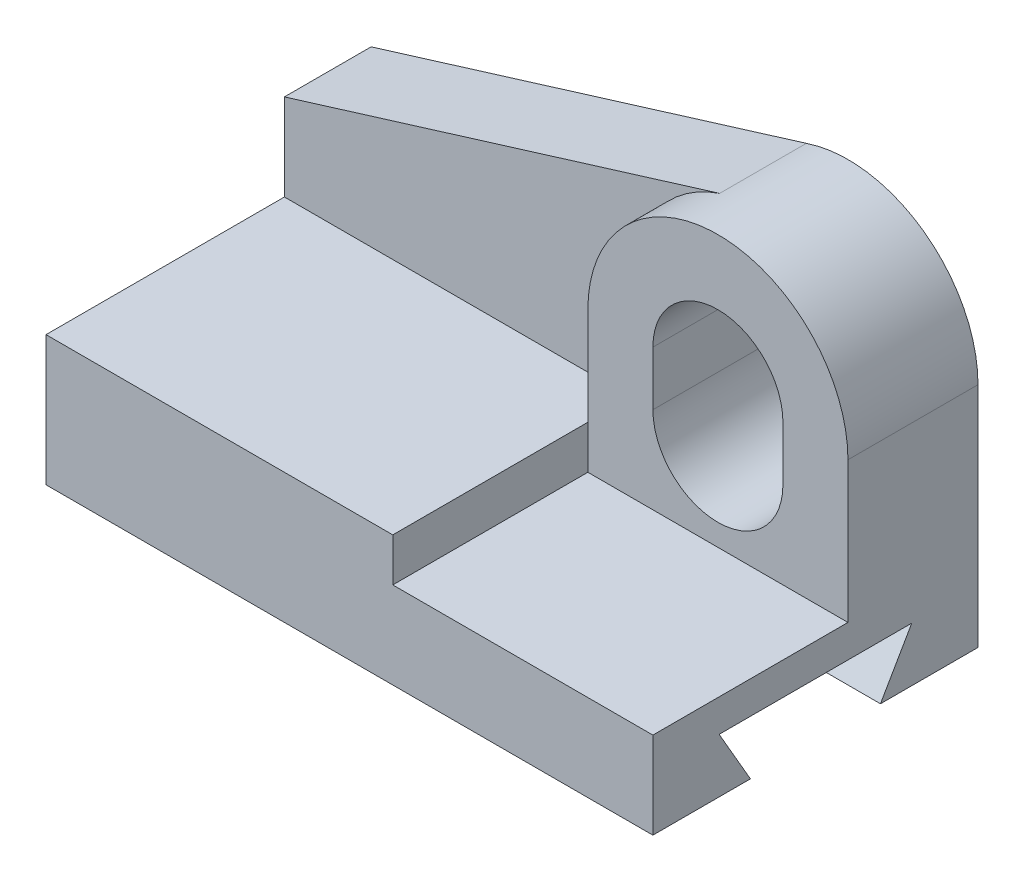
ISO-10303-21;
HEADER;
FILE_DESCRIPTION(('STEP AP214'),'2;1');
FILE_NAME('part.step','',(''),(''),'','','');
FILE_SCHEMA(('AUTOMOTIVE_DESIGN { 1 0 10303 214 1 1 1 1 }'));
ENDSEC;
DATA;
#1=APPLICATION_CONTEXT('core data for automotive mechanical design processes');
#2=APPLICATION_PROTOCOL_DEFINITION('international standard','automotive_design',2000,#1);
#3=PRODUCT_CONTEXT('',#1,'mechanical');
#4=PRODUCT('Part','Part','',(#3));
#5=PRODUCT_RELATED_PRODUCT_CATEGORY('part','',(#4));
#6=PRODUCT_DEFINITION_FORMATION('','',#4);
#7=PRODUCT_DEFINITION_CONTEXT('part definition',#1,'design');
#8=PRODUCT_DEFINITION('design','',#6,#7);
#9=PRODUCT_DEFINITION_SHAPE('','',#8);
#10=(LENGTH_UNIT() NAMED_UNIT(*) SI_UNIT(.MILLI.,.METRE.));
#11=(NAMED_UNIT(*) PLANE_ANGLE_UNIT() SI_UNIT($,.RADIAN.));
#12=(NAMED_UNIT(*) SI_UNIT($,.STERADIAN.) SOLID_ANGLE_UNIT());
#13=UNCERTAINTY_MEASURE_WITH_UNIT(LENGTH_MEASURE(1.E-05),#10,'distance_accuracy_value','');
#14=(GEOMETRIC_REPRESENTATION_CONTEXT(3) GLOBAL_UNCERTAINTY_ASSIGNED_CONTEXT((#13)) GLOBAL_UNIT_ASSIGNED_CONTEXT((#10,
#11,#12)) REPRESENTATION_CONTEXT('',''));
#15=CARTESIAN_POINT('',(0.,0.,0.));
#16=DIRECTION('',(0.,0.,1.));
#17=DIRECTION('',(1.,0.,0.));
#18=AXIS2_PLACEMENT_3D('',#15,#16,#17);
#19=CARTESIAN_POINT('',(0.,0.,30.));
#20=DIRECTION('',(0.,1.,0.));
#21=DIRECTION('',(0.,0.,1.));
#22=AXIS2_PLACEMENT_3D('',#19,#20,#21);
#23=PLANE('',#22);
#24=DIRECTION('',(0.,0.,-1.));
#25=VECTOR('',#24,1.);
#26=CARTESIAN_POINT('',(0.,0.,30.));
#27=LINE('',#26,#25);
#28=CARTESIAN_POINT('',(0.,0.,30.));
#29=VERTEX_POINT('',#28);
#30=CARTESIAN_POINT('',(0.,0.,21.));
#31=VERTEX_POINT('',#30);
#32=EDGE_CURVE('E11',#29,#31,#27,.T.);
#33=ORIENTED_EDGE('',*,*,#32,.T.);
#34=DIRECTION('',(-1.,0.,0.));
#35=VECTOR('',#34,1.);
#36=CARTESIAN_POINT('',(56.,0.,21.));
#37=LINE('',#36,#35);
#38=CARTESIAN_POINT('',(56.,0.,21.));
#39=VERTEX_POINT('',#38);
#40=EDGE_CURVE('E213',#39,#31,#37,.T.);
#41=ORIENTED_EDGE('',*,*,#40,.F.);
#42=DIRECTION('',(0.,0.,-1.));
#43=VECTOR('',#42,1.);
#44=CARTESIAN_POINT('',(56.,0.,30.));
#45=LINE('',#44,#43);
#46=CARTESIAN_POINT('',(56.,0.,30.));
#47=VERTEX_POINT('',#46);
#48=EDGE_CURVE('E199',#47,#39,#45,.T.);
#49=ORIENTED_EDGE('',*,*,#48,.F.);
#50=DIRECTION('',(1.,0.,0.));
#51=VECTOR('',#50,1.);
#52=CARTESIAN_POINT('',(0.,0.,30.));
#53=LINE('',#52,#51);
#54=EDGE_CURVE('E327',#29,#47,#53,.T.);
#55=ORIENTED_EDGE('',*,*,#54,.F.);
#56=EDGE_LOOP('',(#33,#41,#49,#55));
#57=FACE_BOUND('',#56,.T.);
#58=ADVANCED_FACE('F45',(#57),#23,.F.);
#59=CARTESIAN_POINT('',(0.,12.,30.));
#60=DIRECTION('',(1.,0.,0.));
#61=DIRECTION('',(0.,0.,-1.));
#62=AXIS2_PLACEMENT_3D('',#59,#60,#61);
#63=PLANE('',#62);
#64=DIRECTION('',(0.,0.,-1.));
#65=VECTOR('',#64,1.);
#66=CARTESIAN_POINT('',(0.,5.,23.8867513459482));
#67=LINE('',#66,#65);
#68=CARTESIAN_POINT('',(0.,5.,23.8867513459482));
#69=VERTEX_POINT('',#68);
#70=CARTESIAN_POINT('',(0.,5.,6.11324865405184));
#71=VERTEX_POINT('',#70);
#72=EDGE_CURVE('E204',#69,#71,#67,.T.);
#73=ORIENTED_EDGE('',*,*,#72,.F.);
#74=DIRECTION('',(0.,0.866025403784436,0.500000000000004));
#75=VECTOR('',#74,1.);
#76=CARTESIAN_POINT('',(0.,0.,21.));
#77=LINE('',#76,#75);
#78=EDGE_CURVE('E182',#31,#69,#77,.T.);
#79=ORIENTED_EDGE('',*,*,#78,.F.);
#80=ORIENTED_EDGE('',*,*,#32,.F.);
#81=DIRECTION('',(0.,-1.,0.));
#82=VECTOR('',#81,1.);
#83=CARTESIAN_POINT('',(0.,12.,30.));
#84=LINE('',#83,#82);
#85=CARTESIAN_POINT('',(0.,12.,30.));
#86=VERTEX_POINT('',#85);
#87=EDGE_CURVE('E323',#86,#29,#84,.T.);
#88=ORIENTED_EDGE('',*,*,#87,.F.);
#89=DIRECTION('',(0.,0.,-1.));
#90=VECTOR('',#89,1.);
#91=CARTESIAN_POINT('',(0.,12.,30.));
#92=LINE('',#91,#90);
#93=CARTESIAN_POINT('',(0.,12.,8.));
#94=VERTEX_POINT('',#93);
#95=EDGE_CURVE('E343',#86,#94,#92,.T.);
#96=ORIENTED_EDGE('',*,*,#95,.T.);
#97=DIRECTION('',(0.,1.,0.));
#98=VECTOR('',#97,1.);
#99=CARTESIAN_POINT('',(0.,0.,8.));
#100=LINE('',#99,#98);
#101=CARTESIAN_POINT('',(0.,20.,8.));
#102=VERTEX_POINT('',#101);
#103=EDGE_CURVE('E230',#94,#102,#100,.T.);
#104=ORIENTED_EDGE('',*,*,#103,.T.);
#105=DIRECTION('',(0.,0.,-1.));
#106=VECTOR('',#105,1.);
#107=CARTESIAN_POINT('',(0.,20.,8.));
#108=LINE('',#107,#106);
#109=CARTESIAN_POINT('',(0.,20.,0.));
#110=VERTEX_POINT('',#109);
#111=EDGE_CURVE('E239',#102,#110,#108,.T.);
#112=ORIENTED_EDGE('',*,*,#111,.T.);
#113=DIRECTION('',(0.,-1.,0.));
#114=VECTOR('',#113,1.);
#115=CARTESIAN_POINT('',(0.,12.,0.));
#116=LINE('',#115,#114);
#117=CARTESIAN_POINT('',(0.,0.,0.));
#118=VERTEX_POINT('',#117);
#119=EDGE_CURVE('E322',#110,#118,#116,.T.);
#120=ORIENTED_EDGE('',*,*,#119,.T.);
#121=CARTESIAN_POINT('',(0.,0.,9.));
#122=VERTEX_POINT('',#121);
#123=EDGE_CURVE('E54',#122,#118,#27,.T.);
#124=ORIENTED_EDGE('',*,*,#123,.F.);
#125=DIRECTION('',(0.,-0.866025403784436,0.500000000000004));
#126=VECTOR('',#125,1.);
#127=CARTESIAN_POINT('',(0.,0.,9.));
#128=LINE('',#127,#126);
#129=EDGE_CURVE('E201',#71,#122,#128,.T.);
#130=ORIENTED_EDGE('',*,*,#129,.F.);
#131=EDGE_LOOP('',(#73,#79,#80,#88,#96,#104,#112,#120,#124,#130));
#132=FACE_BOUND('',#131,.T.);
#133=ADVANCED_FACE('F47',(#132),#63,.F.);
#134=CARTESIAN_POINT('',(56.,0.,9.));
#135=VERTEX_POINT('',#134);
#136=CARTESIAN_POINT('',(56.,0.,0.));
#137=VERTEX_POINT('',#136);
#138=EDGE_CURVE('E365',#135,#137,#45,.T.);
#139=ORIENTED_EDGE('',*,*,#138,.F.);
#140=DIRECTION('',(-1.,0.,0.));
#141=VECTOR('',#140,1.);
#142=CARTESIAN_POINT('',(56.,0.,9.));
#143=LINE('',#142,#141);
#144=EDGE_CURVE('E217',#135,#122,#143,.T.);
#145=ORIENTED_EDGE('',*,*,#144,.T.);
#146=ORIENTED_EDGE('',*,*,#123,.T.);
#147=DIRECTION('',(1.,0.,0.));
#148=VECTOR('',#147,1.);
#149=CARTESIAN_POINT('',(0.,0.,0.));
#150=LINE('',#149,#148);
#151=EDGE_CURVE('E347',#118,#137,#150,.T.);
#152=ORIENTED_EDGE('',*,*,#151,.T.);
#153=EDGE_LOOP('',(#139,#145,#146,#152));
#154=FACE_BOUND('',#153,.T.);
#155=ADVANCED_FACE('F374',(#154),#23,.F.);
#156=CARTESIAN_POINT('',(56.,0.,30.));
#157=DIRECTION('',(-1.,0.,0.));
#158=DIRECTION('',(0.,0.,1.));
#159=AXIS2_PLACEMENT_3D('',#156,#157,#158);
#160=PLANE('',#159);
#161=ORIENTED_EDGE('',*,*,#48,.T.);
#162=DIRECTION('',(0.,0.866025403784436,0.500000000000004));
#163=VECTOR('',#162,1.);
#164=CARTESIAN_POINT('',(56.,0.,21.));
#165=LINE('',#164,#163);
#166=CARTESIAN_POINT('',(56.,5.,23.8867513459482));
#167=VERTEX_POINT('',#166);
#168=EDGE_CURVE('E179',#39,#167,#165,.T.);
#169=ORIENTED_EDGE('',*,*,#168,.T.);
#170=DIRECTION('',(0.,0.,-1.));
#171=VECTOR('',#170,1.);
#172=CARTESIAN_POINT('',(56.,5.,23.8867513459482));
#173=LINE('',#172,#171);
#174=CARTESIAN_POINT('',(56.,5.,6.11324865405184));
#175=VERTEX_POINT('',#174);
#176=EDGE_CURVE('E190',#167,#175,#173,.T.);
#177=ORIENTED_EDGE('',*,*,#176,.T.);
#178=DIRECTION('',(0.,-0.866025403784436,0.500000000000004));
#179=VECTOR('',#178,1.);
#180=CARTESIAN_POINT('',(56.,0.,9.));
#181=LINE('',#180,#179);
#182=EDGE_CURVE('E61',#175,#135,#181,.T.);
#183=ORIENTED_EDGE('',*,*,#182,.T.);
#184=ORIENTED_EDGE('',*,*,#138,.T.);
#185=DIRECTION('',(0.,1.,0.));
#186=VECTOR('',#185,1.);
#187=CARTESIAN_POINT('',(56.,0.,0.));
#188=LINE('',#187,#186);
#189=CARTESIAN_POINT('',(56.,21.,0.));
#190=VERTEX_POINT('',#189);
#191=EDGE_CURVE('E328',#137,#190,#188,.T.);
#192=ORIENTED_EDGE('',*,*,#191,.T.);
#193=DIRECTION('',(0.,0.,-1.));
#194=VECTOR('',#193,1.);
#195=CARTESIAN_POINT('',(56.,21.,12.));
#196=LINE('',#195,#194);
#197=CARTESIAN_POINT('',(56.,21.,12.));
#198=VERTEX_POINT('',#197);
#199=EDGE_CURVE('E315',#198,#190,#196,.T.);
#200=ORIENTED_EDGE('',*,*,#199,.F.);
#201=DIRECTION('',(0.,1.,0.));
#202=VECTOR('',#201,1.);
#203=CARTESIAN_POINT('',(56.,8.,12.));
#204=LINE('',#203,#202);
#205=CARTESIAN_POINT('',(56.,8.,12.));
#206=VERTEX_POINT('',#205);
#207=EDGE_CURVE('E298',#206,#198,#204,.T.);
#208=ORIENTED_EDGE('',*,*,#207,.F.);
#209=DIRECTION('',(0.,0.,-1.));
#210=VECTOR('',#209,1.);
#211=CARTESIAN_POINT('',(56.,8.,30.));
#212=LINE('',#211,#210);
#213=CARTESIAN_POINT('',(56.,8.,30.));
#214=VERTEX_POINT('',#213);
#215=EDGE_CURVE('E363',#214,#206,#212,.T.);
#216=ORIENTED_EDGE('',*,*,#215,.F.);
#217=DIRECTION('',(0.,1.,0.));
#218=VECTOR('',#217,1.);
#219=CARTESIAN_POINT('',(56.,0.,30.));
#220=LINE('',#219,#218);
#221=EDGE_CURVE('E331',#47,#214,#220,.T.);
#222=ORIENTED_EDGE('',*,*,#221,.F.);
#223=EDGE_LOOP('',(#161,#169,#177,#183,#184,#192,#200,#208,#216,#222));
#224=FACE_BOUND('',#223,.T.);
#225=ADVANCED_FACE('F196',(#224),#160,.F.);
#226=CARTESIAN_POINT('',(56.,8.,30.));
#227=DIRECTION('',(0.,-1.,0.));
#228=DIRECTION('',(1.,0.,0.));
#229=AXIS2_PLACEMENT_3D('',#226,#227,#228);
#230=PLANE('',#229);
#231=ORIENTED_EDGE('',*,*,#215,.T.);
#232=DIRECTION('',(1.,0.,0.));
#233=VECTOR('',#232,1.);
#234=CARTESIAN_POINT('',(32.,8.,12.));
#235=LINE('',#234,#233);
#236=CARTESIAN_POINT('',(32.,8.,12.));
#237=VERTEX_POINT('',#236);
#238=EDGE_CURVE('E294',#237,#206,#235,.T.);
#239=ORIENTED_EDGE('',*,*,#238,.F.);
#240=DIRECTION('',(0.,0.,-1.));
#241=VECTOR('',#240,1.);
#242=CARTESIAN_POINT('',(32.,8.,30.));
#243=LINE('',#242,#241);
#244=CARTESIAN_POINT('',(32.,8.,30.));
#245=VERTEX_POINT('',#244);
#246=EDGE_CURVE('E359',#245,#237,#243,.T.);
#247=ORIENTED_EDGE('',*,*,#246,.F.);
#248=DIRECTION('',(-1.,0.,0.));
#249=VECTOR('',#248,1.);
#250=CARTESIAN_POINT('',(56.,8.,30.));
#251=LINE('',#250,#249);
#252=EDGE_CURVE('E334',#214,#245,#251,.T.);
#253=ORIENTED_EDGE('',*,*,#252,.F.);
#254=EDGE_LOOP('',(#231,#239,#247,#253));
#255=FACE_BOUND('',#254,.T.);
#256=ADVANCED_FACE('F434',(#255),#230,.F.);
#257=CARTESIAN_POINT('',(32.,8.,30.));
#258=DIRECTION('',(-1.,0.,0.));
#259=DIRECTION('',(0.,0.,1.));
#260=AXIS2_PLACEMENT_3D('',#257,#258,#259);
#261=PLANE('',#260);
#262=ORIENTED_EDGE('',*,*,#246,.T.);
#263=DIRECTION('',(0.,-1.,0.));
#264=VECTOR('',#263,1.);
#265=CARTESIAN_POINT('',(32.,8.,12.));
#266=LINE('',#265,#264);
#267=CARTESIAN_POINT('',(32.,12.,12.));
#268=VERTEX_POINT('',#267);
#269=EDGE_CURVE('E304',#268,#237,#266,.T.);
#270=ORIENTED_EDGE('',*,*,#269,.F.);
#271=DIRECTION('',(0.,0.,-1.));
#272=VECTOR('',#271,1.);
#273=CARTESIAN_POINT('',(32.,12.,30.));
#274=LINE('',#273,#272);
#275=CARTESIAN_POINT('',(32.,12.,30.));
#276=VERTEX_POINT('',#275);
#277=EDGE_CURVE('E355',#276,#268,#274,.T.);
#278=ORIENTED_EDGE('',*,*,#277,.F.);
#279=DIRECTION('',(0.,1.,0.));
#280=VECTOR('',#279,1.);
#281=CARTESIAN_POINT('',(32.,8.,30.));
#282=LINE('',#281,#280);
#283=EDGE_CURVE('E337',#245,#276,#282,.T.);
#284=ORIENTED_EDGE('',*,*,#283,.F.);
#285=EDGE_LOOP('',(#262,#270,#278,#284));
#286=FACE_BOUND('',#285,.T.);
#287=ADVANCED_FACE('F405',(#286),#261,.F.);
#288=CARTESIAN_POINT('',(32.,12.,30.));
#289=DIRECTION('',(0.,-1.,0.));
#290=DIRECTION('',(1.,0.,0.));
#291=AXIS2_PLACEMENT_3D('',#288,#289,#290);
#292=PLANE('',#291);
#293=DIRECTION('',(0.,0.,1.));
#294=VECTOR('',#293,1.);
#295=CARTESIAN_POINT('',(32.,12.,30.));
#296=LINE('',#295,#294);
#297=CARTESIAN_POINT('',(32.,12.,8.));
#298=VERTEX_POINT('',#297);
#299=EDGE_CURVE('E319',#298,#268,#296,.T.);
#300=ORIENTED_EDGE('',*,*,#299,.F.);
#301=DIRECTION('',(1.,0.,0.));
#302=VECTOR('',#301,1.);
#303=CARTESIAN_POINT('',(0.,12.,8.));
#304=LINE('',#303,#302);
#305=EDGE_CURVE('E69',#94,#298,#304,.T.);
#306=ORIENTED_EDGE('',*,*,#305,.F.);
#307=ORIENTED_EDGE('',*,*,#95,.F.);
#308=DIRECTION('',(-1.,0.,0.));
#309=VECTOR('',#308,1.);
#310=CARTESIAN_POINT('',(32.,12.,30.));
#311=LINE('',#310,#309);
#312=EDGE_CURVE('E340',#276,#86,#311,.T.);
#313=ORIENTED_EDGE('',*,*,#312,.F.);
#314=ORIENTED_EDGE('',*,*,#277,.T.);
#315=EDGE_LOOP('',(#300,#306,#307,#313,#314));
#316=FACE_BOUND('',#315,.T.);
#317=ADVANCED_FACE('F396',(#316),#292,.F.);
#318=CARTESIAN_POINT('',(0.,0.,30.));
#319=DIRECTION('',(0.,0.,1.));
#320=DIRECTION('',(1.,0.,0.));
#321=AXIS2_PLACEMENT_3D('',#318,#319,#320);
#322=PLANE('',#321);
#323=ORIENTED_EDGE('',*,*,#87,.T.);
#324=ORIENTED_EDGE('',*,*,#54,.T.);
#325=ORIENTED_EDGE('',*,*,#221,.T.);
#326=ORIENTED_EDGE('',*,*,#252,.T.);
#327=ORIENTED_EDGE('',*,*,#283,.T.);
#328=ORIENTED_EDGE('',*,*,#312,.T.);
#329=EDGE_LOOP('',(#323,#324,#325,#326,#327,#328));
#330=FACE_BOUND('',#329,.T.);
#331=ADVANCED_FACE('F399',(#330),#322,.T.);
#332=CARTESIAN_POINT('',(0.,0.,0.));
#333=DIRECTION('',(0.,0.,1.));
#334=DIRECTION('',(1.,0.,0.));
#335=AXIS2_PLACEMENT_3D('',#332,#333,#334);
#336=PLANE('',#335);
#337=ORIENTED_EDGE('',*,*,#119,.F.);
#338=DIRECTION('',(0.955697589411353,0.294350331396669,0.));
#339=VECTOR('',#338,1.);
#340=CARTESIAN_POINT('',(-5.62619804316459,18.2671576481334,0.));
#341=LINE('',#340,#339);
#342=CARTESIAN_POINT('',(40.162675750982,32.3699139226249,0.));
#343=VERTEX_POINT('',#342);
#344=EDGE_CURVE('E216',#110,#343,#341,.T.);
#345=ORIENTED_EDGE('',*,*,#344,.T.);
#346=CARTESIAN_POINT('',(44.,21.,0.));
#347=DIRECTION('',(0.,0.,1.));
#348=DIRECTION('',(1.,0.,0.));
#349=AXIS2_PLACEMENT_3D('',#346,#347,#348);
#350=CIRCLE('',#349,12.);
#351=EDGE_CURVE('E293',#190,#343,#350,.T.);
#352=ORIENTED_EDGE('',*,*,#351,.F.);
#353=ORIENTED_EDGE('',*,*,#191,.F.);
#354=ORIENTED_EDGE('',*,*,#151,.F.);
#355=EDGE_LOOP('',(#337,#345,#352,#353,#354));
#356=FACE_BOUND('',#355,.T.);
#357=CARTESIAN_POINT('',(44.,21.,0.));
#358=DIRECTION('',(0.,0.,1.));
#359=DIRECTION('',(1.,0.,0.));
#360=AXIS2_PLACEMENT_3D('',#357,#358,#359);
#361=CIRCLE('',#360,6.00000000000001);
#362=CARTESIAN_POINT('',(50.,21.,0.));
#363=VERTEX_POINT('',#362);
#364=CARTESIAN_POINT('',(38.,21.,0.));
#365=VERTEX_POINT('',#364);
#366=EDGE_CURVE('E250',#363,#365,#361,.T.);
#367=ORIENTED_EDGE('',*,*,#366,.T.);
#368=DIRECTION('',(0.,-1.,0.));
#369=VECTOR('',#368,1.);
#370=CARTESIAN_POINT('',(38.,21.,0.));
#371=LINE('',#370,#369);
#372=CARTESIAN_POINT('',(38.,16.,0.));
#373=VERTEX_POINT('',#372);
#374=EDGE_CURVE('E269',#365,#373,#371,.T.);
#375=ORIENTED_EDGE('',*,*,#374,.T.);
#376=CARTESIAN_POINT('',(44.,16.,0.));
#377=DIRECTION('',(0.,0.,1.));
#378=DIRECTION('',(1.,0.,0.));
#379=AXIS2_PLACEMENT_3D('',#376,#377,#378);
#380=CIRCLE('',#379,6.00000000000001);
#381=CARTESIAN_POINT('',(50.,16.,0.));
#382=VERTEX_POINT('',#381);
#383=EDGE_CURVE('E273',#373,#382,#380,.T.);
#384=ORIENTED_EDGE('',*,*,#383,.T.);
#385=DIRECTION('',(0.,1.,0.));
#386=VECTOR('',#385,1.);
#387=CARTESIAN_POINT('',(50.,21.,0.));
#388=LINE('',#387,#386);
#389=EDGE_CURVE('E255',#382,#363,#388,.T.);
#390=ORIENTED_EDGE('',*,*,#389,.T.);
#391=EDGE_LOOP('',(#367,#375,#384,#390));
#392=FACE_BOUND('',#391,.T.);
#393=ADVANCED_FACE('F378',(#356,#392),#336,.F.);
#394=CARTESIAN_POINT('',(32.,8.,12.));
#395=DIRECTION('',(1.,0.,0.));
#396=DIRECTION('',(0.,0.,-1.));
#397=AXIS2_PLACEMENT_3D('',#394,#395,#396);
#398=PLANE('',#397);
#399=DIRECTION('',(0.,0.,-1.));
#400=VECTOR('',#399,1.);
#401=CARTESIAN_POINT('',(32.,21.,12.));
#402=LINE('',#401,#400);
#403=CARTESIAN_POINT('',(32.,21.,12.));
#404=VERTEX_POINT('',#403);
#405=CARTESIAN_POINT('',(32.,21.,8.));
#406=VERTEX_POINT('',#405);
#407=EDGE_CURVE('E309',#404,#406,#402,.T.);
#408=ORIENTED_EDGE('',*,*,#407,.T.);
#409=DIRECTION('',(0.,-1.,0.));
#410=VECTOR('',#409,1.);
#411=CARTESIAN_POINT('',(32.,0.,8.));
#412=LINE('',#411,#410);
#413=EDGE_CURVE('E236',#406,#298,#412,.T.);
#414=ORIENTED_EDGE('',*,*,#413,.T.);
#415=ORIENTED_EDGE('',*,*,#299,.T.);
#416=EDGE_CURVE('E305',#404,#268,#266,.T.);
#417=ORIENTED_EDGE('',*,*,#416,.F.);
#418=EDGE_LOOP('',(#408,#414,#415,#417));
#419=FACE_BOUND('',#418,.T.);
#420=ADVANCED_FACE('F414',(#419),#398,.F.);
#421=CARTESIAN_POINT('',(44.,21.,12.));
#422=DIRECTION('',(0.,0.,1.));
#423=DIRECTION('',(1.,0.,0.));
#424=AXIS2_PLACEMENT_3D('',#421,#422,#423);
#425=PLANE('',#424);
#426=ORIENTED_EDGE('',*,*,#238,.T.);
#427=ORIENTED_EDGE('',*,*,#207,.T.);
#428=CARTESIAN_POINT('',(44.,21.,12.));
#429=DIRECTION('',(0.,0.,1.));
#430=DIRECTION('',(1.,0.,0.));
#431=AXIS2_PLACEMENT_3D('',#428,#429,#430);
#432=CIRCLE('',#431,12.);
#433=EDGE_CURVE('E301',#198,#404,#432,.T.);
#434=ORIENTED_EDGE('',*,*,#433,.T.);
#435=ORIENTED_EDGE('',*,*,#416,.T.);
#436=ORIENTED_EDGE('',*,*,#269,.T.);
#437=EDGE_LOOP('',(#426,#427,#434,#435,#436));
#438=FACE_BOUND('',#437,.T.);
#439=DIRECTION('',(0.,-1.,0.));
#440=VECTOR('',#439,1.);
#441=CARTESIAN_POINT('',(38.,21.,12.));
#442=LINE('',#441,#440);
#443=CARTESIAN_POINT('',(38.,21.,12.));
#444=VERTEX_POINT('',#443);
#445=CARTESIAN_POINT('',(38.,16.,12.));
#446=VERTEX_POINT('',#445);
#447=EDGE_CURVE('E254',#444,#446,#442,.T.);
#448=ORIENTED_EDGE('',*,*,#447,.F.);
#449=CARTESIAN_POINT('',(44.,21.,12.));
#450=DIRECTION('',(0.,0.,1.));
#451=DIRECTION('',(1.,0.,0.));
#452=AXIS2_PLACEMENT_3D('',#449,#450,#451);
#453=CIRCLE('',#452,6.00000000000001);
#454=CARTESIAN_POINT('',(50.,21.,12.));
#455=VERTEX_POINT('',#454);
#456=EDGE_CURVE('E251',#455,#444,#453,.T.);
#457=ORIENTED_EDGE('',*,*,#456,.F.);
#458=DIRECTION('',(0.,1.,0.));
#459=VECTOR('',#458,1.);
#460=CARTESIAN_POINT('',(50.,21.,12.));
#461=LINE('',#460,#459);
#462=CARTESIAN_POINT('',(50.,16.,12.));
#463=VERTEX_POINT('',#462);
#464=EDGE_CURVE('E262',#463,#455,#461,.T.);
#465=ORIENTED_EDGE('',*,*,#464,.F.);
#466=CARTESIAN_POINT('',(44.,16.,12.));
#467=DIRECTION('',(0.,0.,1.));
#468=DIRECTION('',(1.,0.,0.));
#469=AXIS2_PLACEMENT_3D('',#466,#467,#468);
#470=CIRCLE('',#469,6.00000000000001);
#471=EDGE_CURVE('E258',#446,#463,#470,.T.);
#472=ORIENTED_EDGE('',*,*,#471,.F.);
#473=EDGE_LOOP('',(#448,#457,#465,#472));
#474=FACE_BOUND('',#473,.T.);
#475=ADVANCED_FACE('F409',(#438,#474),#425,.T.);
#476=CARTESIAN_POINT('',(44.,21.,12.));
#477=DIRECTION('',(0.,0.,-1.));
#478=DIRECTION('',(-1.,0.,0.));
#479=AXIS2_PLACEMENT_3D('',#476,#477,#478);
#480=CYLINDRICAL_SURFACE('',#479,12.);
#481=ORIENTED_EDGE('',*,*,#351,.T.);
#482=DIRECTION('',(0.,0.,-1.));
#483=VECTOR('',#482,1.);
#484=CARTESIAN_POINT('',(40.162675750982,32.3699139226249,8.));
#485=LINE('',#484,#483);
#486=CARTESIAN_POINT('',(40.162675750982,32.3699139226249,8.));
#487=VERTEX_POINT('',#486);
#488=EDGE_CURVE('E246',#487,#343,#485,.T.);
#489=ORIENTED_EDGE('',*,*,#488,.F.);
#490=CARTESIAN_POINT('',(44.,21.,8.));
#491=DIRECTION('',(0.,0.,1.));
#492=DIRECTION('',(1.,0.,0.));
#493=AXIS2_PLACEMENT_3D('',#490,#491,#492);
#494=CIRCLE('',#493,12.);
#495=EDGE_CURVE('E223',#487,#406,#494,.T.);
#496=ORIENTED_EDGE('',*,*,#495,.T.);
#497=ORIENTED_EDGE('',*,*,#407,.F.);
#498=ORIENTED_EDGE('',*,*,#433,.F.);
#499=ORIENTED_EDGE('',*,*,#199,.T.);
#500=EDGE_LOOP('',(#481,#489,#496,#497,#498,#499));
#501=FACE_BOUND('',#500,.T.);
#502=ADVANCED_FACE('F382',(#501),#480,.T.);
#503=CARTESIAN_POINT('',(44.,21.,12.));
#504=DIRECTION('',(0.,0.,-1.));
#505=DIRECTION('',(-1.,0.,0.));
#506=AXIS2_PLACEMENT_3D('',#503,#504,#505);
#507=CYLINDRICAL_SURFACE('',#506,6.00000000000001);
#508=ORIENTED_EDGE('',*,*,#366,.F.);
#509=DIRECTION('',(0.,0.,-1.));
#510=VECTOR('',#509,1.);
#511=CARTESIAN_POINT('',(50.,21.,12.));
#512=LINE('',#511,#510);
#513=EDGE_CURVE('E265',#455,#363,#512,.T.);
#514=ORIENTED_EDGE('',*,*,#513,.F.);
#515=ORIENTED_EDGE('',*,*,#456,.T.);
#516=DIRECTION('',(0.,0.,-1.));
#517=VECTOR('',#516,1.);
#518=CARTESIAN_POINT('',(38.,21.,12.));
#519=LINE('',#518,#517);
#520=EDGE_CURVE('E289',#444,#365,#519,.T.);
#521=ORIENTED_EDGE('',*,*,#520,.T.);
#522=EDGE_LOOP('',(#508,#514,#515,#521));
#523=FACE_BOUND('',#522,.T.);
#524=ADVANCED_FACE('F447',(#523),#507,.F.);
#525=CARTESIAN_POINT('',(38.,21.,12.));
#526=DIRECTION('',(1.,0.,0.));
#527=DIRECTION('',(0.,0.,-1.));
#528=AXIS2_PLACEMENT_3D('',#525,#526,#527);
#529=PLANE('',#528);
#530=ORIENTED_EDGE('',*,*,#374,.F.);
#531=ORIENTED_EDGE('',*,*,#520,.F.);
#532=ORIENTED_EDGE('',*,*,#447,.T.);
#533=DIRECTION('',(0.,0.,-1.));
#534=VECTOR('',#533,1.);
#535=CARTESIAN_POINT('',(38.,16.,12.));
#536=LINE('',#535,#534);
#537=EDGE_CURVE('E286',#446,#373,#536,.T.);
#538=ORIENTED_EDGE('',*,*,#537,.T.);
#539=EDGE_LOOP('',(#530,#531,#532,#538));
#540=FACE_BOUND('',#539,.T.);
#541=ADVANCED_FACE('F451',(#540),#529,.T.);
#542=CARTESIAN_POINT('',(44.,16.,12.));
#543=DIRECTION('',(0.,0.,-1.));
#544=DIRECTION('',(-1.,0.,0.));
#545=AXIS2_PLACEMENT_3D('',#542,#543,#544);
#546=CYLINDRICAL_SURFACE('',#545,6.00000000000001);
#547=ORIENTED_EDGE('',*,*,#383,.F.);
#548=ORIENTED_EDGE('',*,*,#537,.F.);
#549=ORIENTED_EDGE('',*,*,#471,.T.);
#550=DIRECTION('',(0.,0.,-1.));
#551=VECTOR('',#550,1.);
#552=CARTESIAN_POINT('',(50.,16.,12.));
#553=LINE('',#552,#551);
#554=EDGE_CURVE('E283',#463,#382,#553,.T.);
#555=ORIENTED_EDGE('',*,*,#554,.T.);
#556=EDGE_LOOP('',(#547,#548,#549,#555));
#557=FACE_BOUND('',#556,.T.);
#558=ADVANCED_FACE('F457',(#557),#546,.F.);
#559=CARTESIAN_POINT('',(50.,21.,12.));
#560=DIRECTION('',(-1.,0.,0.));
#561=DIRECTION('',(0.,0.,1.));
#562=AXIS2_PLACEMENT_3D('',#559,#560,#561);
#563=PLANE('',#562);
#564=ORIENTED_EDGE('',*,*,#389,.F.);
#565=ORIENTED_EDGE('',*,*,#554,.F.);
#566=ORIENTED_EDGE('',*,*,#464,.T.);
#567=ORIENTED_EDGE('',*,*,#513,.T.);
#568=EDGE_LOOP('',(#564,#565,#566,#567));
#569=FACE_BOUND('',#568,.T.);
#570=ADVANCED_FACE('F463',(#569),#563,.T.);
#571=CARTESIAN_POINT('',(-5.62619804316459,18.2671576481334,8.));
#572=DIRECTION('',(-0.294350331396669,0.955697589411353,0.));
#573=DIRECTION('',(-0.955697589411353,-0.294350331396669,0.));
#574=AXIS2_PLACEMENT_3D('',#571,#572,#573);
#575=PLANE('',#574);
#576=ORIENTED_EDGE('',*,*,#344,.F.);
#577=ORIENTED_EDGE('',*,*,#111,.F.);
#578=DIRECTION('',(0.955697589411353,0.294350331396669,0.));
#579=VECTOR('',#578,1.);
#580=CARTESIAN_POINT('',(-5.62619804316459,18.2671576481334,8.));
#581=LINE('',#580,#579);
#582=EDGE_CURVE('E226',#102,#487,#581,.T.);
#583=ORIENTED_EDGE('',*,*,#582,.T.);
#584=ORIENTED_EDGE('',*,*,#488,.T.);
#585=EDGE_LOOP('',(#576,#577,#583,#584));
#586=FACE_BOUND('',#585,.T.);
#587=ADVANCED_FACE('F386',(#586),#575,.T.);
#588=CARTESIAN_POINT('',(0.,0.,8.));
#589=DIRECTION('',(0.,0.,1.));
#590=DIRECTION('',(1.,0.,0.));
#591=AXIS2_PLACEMENT_3D('',#588,#589,#590);
#592=PLANE('',#591);
#593=ORIENTED_EDGE('',*,*,#495,.F.);
#594=ORIENTED_EDGE('',*,*,#582,.F.);
#595=ORIENTED_EDGE('',*,*,#103,.F.);
#596=ORIENTED_EDGE('',*,*,#305,.T.);
#597=ORIENTED_EDGE('',*,*,#413,.F.);
#598=EDGE_LOOP('',(#593,#594,#595,#596,#597));
#599=FACE_BOUND('',#598,.T.);
#600=ADVANCED_FACE('F390',(#599),#592,.T.);
#601=CARTESIAN_POINT('',(56.,0.,21.));
#602=DIRECTION('',(0.,-0.500000000000004,0.866025403784436));
#603=DIRECTION('',(0.,-0.866025403784437,-0.500000000000004));
#604=AXIS2_PLACEMENT_3D('',#601,#602,#603);
#605=PLANE('',#604);
#606=ORIENTED_EDGE('',*,*,#78,.T.);
#607=DIRECTION('',(-1.,0.,0.));
#608=VECTOR('',#607,1.);
#609=CARTESIAN_POINT('',(56.,5.,23.8867513459482));
#610=LINE('',#609,#608);
#611=EDGE_CURVE('E175',#167,#69,#610,.T.);
#612=ORIENTED_EDGE('',*,*,#611,.F.);
#613=ORIENTED_EDGE('',*,*,#168,.F.);
#614=ORIENTED_EDGE('',*,*,#40,.T.);
#615=EDGE_LOOP('',(#606,#612,#613,#614));
#616=FACE_BOUND('',#615,.T.);
#617=ADVANCED_FACE('F177',(#616),#605,.F.);
#618=CARTESIAN_POINT('',(56.,0.,9.));
#619=DIRECTION('',(0.,-0.500000000000004,-0.866025403784436));
#620=DIRECTION('',(0.,0.866025403784437,-0.500000000000004));
#621=AXIS2_PLACEMENT_3D('',#618,#619,#620);
#622=PLANE('',#621);
#623=ORIENTED_EDGE('',*,*,#129,.T.);
#624=ORIENTED_EDGE('',*,*,#144,.F.);
#625=ORIENTED_EDGE('',*,*,#182,.F.);
#626=DIRECTION('',(-1.,0.,0.));
#627=VECTOR('',#626,1.);
#628=CARTESIAN_POINT('',(56.,5.,6.11324865405184));
#629=LINE('',#628,#627);
#630=EDGE_CURVE('E187',#175,#71,#629,.T.);
#631=ORIENTED_EDGE('',*,*,#630,.T.);
#632=EDGE_LOOP('',(#623,#624,#625,#631));
#633=FACE_BOUND('',#632,.T.);
#634=ADVANCED_FACE('F474',(#633),#622,.F.);
#635=CARTESIAN_POINT('',(56.,5.,23.8867513459482));
#636=DIRECTION('',(0.,1.,0.));
#637=DIRECTION('',(0.,0.,1.));
#638=AXIS2_PLACEMENT_3D('',#635,#636,#637);
#639=PLANE('',#638);
#640=ORIENTED_EDGE('',*,*,#72,.T.);
#641=ORIENTED_EDGE('',*,*,#630,.F.);
#642=ORIENTED_EDGE('',*,*,#176,.F.);
#643=ORIENTED_EDGE('',*,*,#611,.T.);
#644=EDGE_LOOP('',(#640,#641,#642,#643));
#645=FACE_BOUND('',#644,.T.);
#646=ADVANCED_FACE('F191',(#645),#639,.F.);
#647=CLOSED_SHELL('',(#58,#133,#155,#225,#256,#287,#317,#331,#393,#420,#475,#502,#524,#541,#558,
#570,#587,#600,#617,#634,#646));
#648=MANIFOLD_SOLID_BREP('B2',#647);
#649=ADVANCED_BREP_SHAPE_REPRESENTATION('',(#18,#648),#14);
#650=SHAPE_DEFINITION_REPRESENTATION(#9,#649);
ENDSEC;
END-ISO-10303-21;
